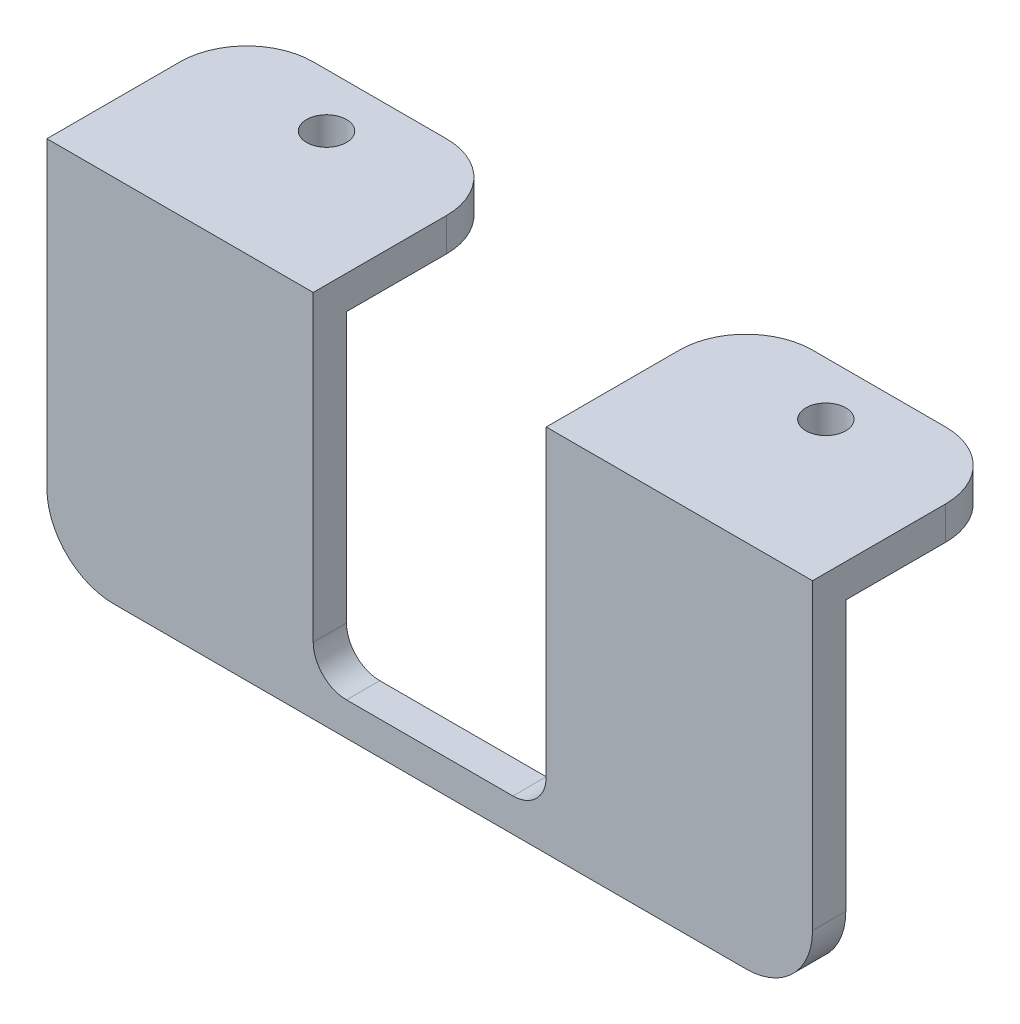
ISO-10303-21;
HEADER;
FILE_DESCRIPTION(('STEP AP214'),'2;1');
FILE_NAME('part.step','',(''),(''),'','','');
FILE_SCHEMA(('AUTOMOTIVE_DESIGN { 1 0 10303 214 1 1 1 1 }'));
ENDSEC;
DATA;
#1=APPLICATION_CONTEXT('core data for automotive mechanical design processes');
#2=APPLICATION_PROTOCOL_DEFINITION('international standard','automotive_design',2000,#1);
#3=PRODUCT_CONTEXT('',#1,'mechanical');
#4=PRODUCT('Part','Part','',(#3));
#5=PRODUCT_RELATED_PRODUCT_CATEGORY('part','',(#4));
#6=PRODUCT_DEFINITION_FORMATION('','',#4);
#7=PRODUCT_DEFINITION_CONTEXT('part definition',#1,'design');
#8=PRODUCT_DEFINITION('design','',#6,#7);
#9=PRODUCT_DEFINITION_SHAPE('','',#8);
#10=(LENGTH_UNIT() NAMED_UNIT(*) SI_UNIT(.MILLI.,.METRE.));
#11=(NAMED_UNIT(*) PLANE_ANGLE_UNIT() SI_UNIT($,.RADIAN.));
#12=(NAMED_UNIT(*) SI_UNIT($,.STERADIAN.) SOLID_ANGLE_UNIT());
#13=UNCERTAINTY_MEASURE_WITH_UNIT(LENGTH_MEASURE(1.E-05),#10,'distance_accuracy_value','');
#14=(GEOMETRIC_REPRESENTATION_CONTEXT(3) GLOBAL_UNCERTAINTY_ASSIGNED_CONTEXT((#13)) GLOBAL_UNIT_ASSIGNED_CONTEXT((#10,
#11,#12)) REPRESENTATION_CONTEXT('',''));
#15=CARTESIAN_POINT('',(0.,0.,0.));
#16=DIRECTION('',(0.,0.,1.));
#17=DIRECTION('',(1.,0.,0.));
#18=AXIS2_PLACEMENT_3D('',#15,#16,#17);
#19=CARTESIAN_POINT('',(0.,0.,0.));
#20=DIRECTION('',(0.,1.,0.));
#21=DIRECTION('',(0.,0.,1.));
#22=AXIS2_PLACEMENT_3D('',#19,#20,#21);
#23=PLANE('',#22);
#24=CARTESIAN_POINT('',(37.5,0.,-22.));
#25=DIRECTION('',(0.,1.,0.));
#26=DIRECTION('',(0.,0.,1.));
#27=AXIS2_PLACEMENT_3D('',#24,#25,#26);
#28=CIRCLE('',#27,3.);
#29=CARTESIAN_POINT('',(37.5,0.,-19.));
#30=VERTEX_POINT('',#29);
#31=EDGE_CURVE('E313',#30,#30,#28,.T.);
#32=ORIENTED_EDGE('',*,*,#31,.T.);
#33=EDGE_LOOP('',(#32));
#34=FACE_BOUND('',#33,.T.);
#35=DIRECTION('',(-1.,0.,0.));
#36=VECTOR('',#35,1.);
#37=CARTESIAN_POINT('',(17.5,0.,-30.));
#38=LINE('',#37,#36);
#39=CARTESIAN_POINT('',(47.5,0.,-30.));
#40=VERTEX_POINT('',#39);
#41=CARTESIAN_POINT('',(27.5,0.,-30.));
#42=VERTEX_POINT('',#41);
#43=EDGE_CURVE('E347',#40,#42,#38,.T.);
#44=ORIENTED_EDGE('',*,*,#43,.F.);
#45=CARTESIAN_POINT('',(47.5,0.,-20.));
#46=DIRECTION('',(0.,1.,0.));
#47=DIRECTION('',(0.,0.,1.));
#48=AXIS2_PLACEMENT_3D('',#45,#46,#47);
#49=CIRCLE('',#48,10.);
#50=CARTESIAN_POINT('',(57.5,0.,-20.));
#51=VERTEX_POINT('',#50);
#52=EDGE_CURVE('E408',#40,#51,#49,.F.);
#53=ORIENTED_EDGE('',*,*,#52,.T.);
#54=DIRECTION('',(0.,0.,-1.));
#55=VECTOR('',#54,1.);
#56=CARTESIAN_POINT('',(57.5,0.,-30.));
#57=LINE('',#56,#55);
#58=CARTESIAN_POINT('',(57.5,0.,-5.));
#59=VERTEX_POINT('',#58);
#60=EDGE_CURVE('E359',#59,#51,#57,.T.);
#61=ORIENTED_EDGE('',*,*,#60,.F.);
#62=DIRECTION('',(1.,0.,0.));
#63=VECTOR('',#62,1.);
#64=CARTESIAN_POINT('',(17.5,0.,-5.));
#65=LINE('',#64,#63);
#66=CARTESIAN_POINT('',(17.5,0.,-5.));
#67=VERTEX_POINT('',#66);
#68=EDGE_CURVE('E326',#67,#59,#65,.T.);
#69=ORIENTED_EDGE('',*,*,#68,.F.);
#70=DIRECTION('',(0.,0.,1.));
#71=VECTOR('',#70,1.);
#72=CARTESIAN_POINT('',(17.5,0.,-30.));
#73=LINE('',#72,#71);
#74=CARTESIAN_POINT('',(17.5,0.,-20.));
#75=VERTEX_POINT('',#74);
#76=EDGE_CURVE('E342',#75,#67,#73,.T.);
#77=ORIENTED_EDGE('',*,*,#76,.F.);
#78=CARTESIAN_POINT('',(27.5,0.,-20.));
#79=DIRECTION('',(0.,1.,0.));
#80=DIRECTION('',(0.,0.,1.));
#81=AXIS2_PLACEMENT_3D('',#78,#79,#80);
#82=CIRCLE('',#81,10.);
#83=EDGE_CURVE('E405',#75,#42,#82,.F.);
#84=ORIENTED_EDGE('',*,*,#83,.T.);
#85=EDGE_LOOP('',(#44,#53,#61,#69,#77,#84));
#86=FACE_BOUND('',#85,.T.);
#87=ADVANCED_FACE('F45',(#34,#86),#23,.F.);
#88=CARTESIAN_POINT('',(17.5,5.,-30.));
#89=DIRECTION('',(1.,0.,0.));
#90=DIRECTION('',(0.,0.,-1.));
#91=AXIS2_PLACEMENT_3D('',#88,#89,#90);
#92=PLANE('',#91);
#93=DIRECTION('',(0.,0.,1.));
#94=VECTOR('',#93,1.);
#95=CARTESIAN_POINT('',(17.5,5.,-30.));
#96=LINE('',#95,#94);
#97=CARTESIAN_POINT('',(17.5,5.,-20.));
#98=VERTEX_POINT('',#97);
#99=CARTESIAN_POINT('',(17.5,5.,0.));
#100=VERTEX_POINT('',#99);
#101=EDGE_CURVE('E343',#98,#100,#96,.T.);
#102=ORIENTED_EDGE('',*,*,#101,.F.);
#103=DIRECTION('',(0.,-1.,0.));
#104=VECTOR('',#103,1.);
#105=CARTESIAN_POINT('',(17.5,5.,-20.));
#106=LINE('',#105,#104);
#107=EDGE_CURVE('E11',#98,#75,#106,.T.);
#108=ORIENTED_EDGE('',*,*,#107,.T.);
#109=ORIENTED_EDGE('',*,*,#76,.T.);
#110=DIRECTION('',(0.,1.,0.));
#111=VECTOR('',#110,1.);
#112=CARTESIAN_POINT('',(17.5,-45.5,-5.));
#113=LINE('',#112,#111);
#114=CARTESIAN_POINT('',(17.5,-40.5,-5.));
#115=VERTEX_POINT('',#114);
#116=EDGE_CURVE('E338',#115,#67,#113,.T.);
#117=ORIENTED_EDGE('',*,*,#116,.F.);
#118=DIRECTION('',(0.,0.,-1.));
#119=VECTOR('',#118,1.);
#120=CARTESIAN_POINT('',(17.5,-40.5,0.));
#121=LINE('',#120,#119);
#122=CARTESIAN_POINT('',(17.5,-40.5,0.));
#123=VERTEX_POINT('',#122);
#124=EDGE_CURVE('E389',#115,#123,#121,.F.);
#125=ORIENTED_EDGE('',*,*,#124,.T.);
#126=DIRECTION('',(0.,-1.,0.));
#127=VECTOR('',#126,1.);
#128=CARTESIAN_POINT('',(17.5,5.,0.));
#129=LINE('',#128,#127);
#130=EDGE_CURVE('E368',#100,#123,#129,.T.);
#131=ORIENTED_EDGE('',*,*,#130,.F.);
#132=EDGE_LOOP('',(#102,#108,#109,#117,#125,#131));
#133=FACE_BOUND('',#132,.T.);
#134=ADVANCED_FACE('F476',(#133),#92,.F.);
#135=CARTESIAN_POINT('',(17.5,5.,0.));
#136=DIRECTION('',(0.,0.,-1.));
#137=DIRECTION('',(-1.,0.,0.));
#138=AXIS2_PLACEMENT_3D('',#135,#136,#137);
#139=PLANE('',#138);
#140=DIRECTION('',(-1.,0.,0.));
#141=VECTOR('',#140,1.);
#142=CARTESIAN_POINT('',(57.5,-50.5,0.));
#143=LINE('',#142,#141);
#144=CARTESIAN_POINT('',(47.5,-50.5,0.));
#145=VERTEX_POINT('',#144);
#146=CARTESIAN_POINT('',(-47.5,-50.5,0.));
#147=VERTEX_POINT('',#146);
#148=EDGE_CURVE('E318',#145,#147,#143,.T.);
#149=ORIENTED_EDGE('',*,*,#148,.F.);
#150=CARTESIAN_POINT('',(47.5,-40.5,0.));
#151=DIRECTION('',(0.,0.,-1.));
#152=DIRECTION('',(-1.,0.,0.));
#153=AXIS2_PLACEMENT_3D('',#150,#151,#152);
#154=CIRCLE('',#153,10.);
#155=CARTESIAN_POINT('',(57.5,-40.5,0.));
#156=VERTEX_POINT('',#155);
#157=EDGE_CURVE('E376',#145,#156,#154,.F.);
#158=ORIENTED_EDGE('',*,*,#157,.T.);
#159=DIRECTION('',(0.,-1.,0.));
#160=VECTOR('',#159,1.);
#161=CARTESIAN_POINT('',(57.5,5.,0.));
#162=LINE('',#161,#160);
#163=CARTESIAN_POINT('',(57.5,5.,0.));
#164=VERTEX_POINT('',#163);
#165=EDGE_CURVE('E356',#164,#156,#162,.T.);
#166=ORIENTED_EDGE('',*,*,#165,.F.);
#167=DIRECTION('',(1.,0.,0.));
#168=VECTOR('',#167,1.);
#169=CARTESIAN_POINT('',(17.5,5.,0.));
#170=LINE('',#169,#168);
#171=EDGE_CURVE('E346',#100,#164,#170,.T.);
#172=ORIENTED_EDGE('',*,*,#171,.F.);
#173=ORIENTED_EDGE('',*,*,#130,.T.);
#174=CARTESIAN_POINT('',(12.5,-40.5,0.));
#175=DIRECTION('',(0.,0.,-1.));
#176=DIRECTION('',(-1.,0.,0.));
#177=AXIS2_PLACEMENT_3D('',#174,#175,#176);
#178=CIRCLE('',#177,5.);
#179=CARTESIAN_POINT('',(12.5,-45.5,0.));
#180=VERTEX_POINT('',#179);
#181=EDGE_CURVE('E395',#123,#180,#178,.T.);
#182=ORIENTED_EDGE('',*,*,#181,.T.);
#183=DIRECTION('',(-1.,0.,0.));
#184=VECTOR('',#183,1.);
#185=CARTESIAN_POINT('',(57.5,-45.5,0.));
#186=LINE('',#185,#184);
#187=CARTESIAN_POINT('',(-12.5,-45.5,0.));
#188=VERTEX_POINT('',#187);
#189=EDGE_CURVE('E317',#180,#188,#186,.T.);
#190=ORIENTED_EDGE('',*,*,#189,.T.);
#191=CARTESIAN_POINT('',(-12.5,-40.5,0.));
#192=DIRECTION('',(0.,0.,1.));
#193=DIRECTION('',(1.,0.,0.));
#194=AXIS2_PLACEMENT_3D('',#191,#192,#193);
#195=CIRCLE('',#194,5.);
#196=CARTESIAN_POINT('',(-17.5,-40.5,0.));
#197=VERTEX_POINT('',#196);
#198=EDGE_CURVE('E280',#197,#188,#195,.T.);
#199=ORIENTED_EDGE('',*,*,#198,.F.);
#200=DIRECTION('',(0.,-1.,0.));
#201=VECTOR('',#200,1.);
#202=CARTESIAN_POINT('',(-17.5,5.,0.));
#203=LINE('',#202,#201);
#204=CARTESIAN_POINT('',(-17.5,5.,0.));
#205=VERTEX_POINT('',#204);
#206=EDGE_CURVE('E252',#205,#197,#203,.T.);
#207=ORIENTED_EDGE('',*,*,#206,.F.);
#208=DIRECTION('',(-1.,0.,0.));
#209=VECTOR('',#208,1.);
#210=CARTESIAN_POINT('',(-17.5,5.,0.));
#211=LINE('',#210,#209);
#212=CARTESIAN_POINT('',(-57.5,5.,0.));
#213=VERTEX_POINT('',#212);
#214=EDGE_CURVE('E233',#205,#213,#211,.T.);
#215=ORIENTED_EDGE('',*,*,#214,.T.);
#216=DIRECTION('',(0.,-1.,0.));
#217=VECTOR('',#216,1.);
#218=CARTESIAN_POINT('',(-57.5,5.,0.));
#219=LINE('',#218,#217);
#220=CARTESIAN_POINT('',(-57.5,-40.5,0.));
#221=VERTEX_POINT('',#220);
#222=EDGE_CURVE('E244',#213,#221,#219,.T.);
#223=ORIENTED_EDGE('',*,*,#222,.T.);
#224=CARTESIAN_POINT('',(-47.5,-40.5,0.));
#225=DIRECTION('',(0.,0.,1.));
#226=DIRECTION('',(1.,0.,0.));
#227=AXIS2_PLACEMENT_3D('',#224,#225,#226);
#228=CIRCLE('',#227,10.);
#229=EDGE_CURVE('E260',#147,#221,#228,.F.);
#230=ORIENTED_EDGE('',*,*,#229,.F.);
#231=EDGE_LOOP('',(#149,#158,#166,#172,#173,#182,#190,#199,#207,#215,#223,#230));
#232=FACE_BOUND('',#231,.T.);
#233=ADVANCED_FACE('F440',(#232),#139,.F.);
#234=CARTESIAN_POINT('',(57.5,5.,-30.));
#235=DIRECTION('',(-1.,0.,0.));
#236=DIRECTION('',(0.,0.,1.));
#237=AXIS2_PLACEMENT_3D('',#234,#235,#236);
#238=PLANE('',#237);
#239=ORIENTED_EDGE('',*,*,#60,.T.);
#240=DIRECTION('',(0.,-1.,0.));
#241=VECTOR('',#240,1.);
#242=CARTESIAN_POINT('',(57.5,5.,-20.));
#243=LINE('',#242,#241);
#244=CARTESIAN_POINT('',(57.5,5.,-20.));
#245=VERTEX_POINT('',#244);
#246=EDGE_CURVE('E69',#51,#245,#243,.F.);
#247=ORIENTED_EDGE('',*,*,#246,.T.);
#248=DIRECTION('',(0.,0.,-1.));
#249=VECTOR('',#248,1.);
#250=CARTESIAN_POINT('',(57.5,5.,-30.));
#251=LINE('',#250,#249);
#252=EDGE_CURVE('E350',#164,#245,#251,.T.);
#253=ORIENTED_EDGE('',*,*,#252,.F.);
#254=ORIENTED_EDGE('',*,*,#165,.T.);
#255=DIRECTION('',(0.,0.,1.));
#256=VECTOR('',#255,1.);
#257=CARTESIAN_POINT('',(57.5,-40.5,-5.));
#258=LINE('',#257,#256);
#259=CARTESIAN_POINT('',(57.5,-40.5,-5.));
#260=VERTEX_POINT('',#259);
#261=EDGE_CURVE('E379',#156,#260,#258,.F.);
#262=ORIENTED_EDGE('',*,*,#261,.T.);
#263=DIRECTION('',(0.,1.,0.));
#264=VECTOR('',#263,1.);
#265=CARTESIAN_POINT('',(57.5,-45.5,-5.));
#266=LINE('',#265,#264);
#267=EDGE_CURVE('E335',#260,#59,#266,.T.);
#268=ORIENTED_EDGE('',*,*,#267,.T.);
#269=EDGE_LOOP('',(#239,#247,#253,#254,#262,#268));
#270=FACE_BOUND('',#269,.T.);
#271=ADVANCED_FACE('F428',(#270),#238,.F.);
#272=CARTESIAN_POINT('',(17.5,5.,-30.));
#273=DIRECTION('',(0.,0.,1.));
#274=DIRECTION('',(1.,0.,0.));
#275=AXIS2_PLACEMENT_3D('',#272,#273,#274);
#276=PLANE('',#275);
#277=DIRECTION('',(-1.,0.,0.));
#278=VECTOR('',#277,1.);
#279=CARTESIAN_POINT('',(17.5,5.,-30.));
#280=LINE('',#279,#278);
#281=CARTESIAN_POINT('',(47.5,5.,-30.));
#282=VERTEX_POINT('',#281);
#283=CARTESIAN_POINT('',(27.5,5.,-30.));
#284=VERTEX_POINT('',#283);
#285=EDGE_CURVE('E353',#282,#284,#280,.T.);
#286=ORIENTED_EDGE('',*,*,#285,.F.);
#287=DIRECTION('',(0.,-1.,0.));
#288=VECTOR('',#287,1.);
#289=CARTESIAN_POINT('',(47.5,5.,-30.));
#290=LINE('',#289,#288);
#291=EDGE_CURVE('E401',#282,#40,#290,.T.);
#292=ORIENTED_EDGE('',*,*,#291,.T.);
#293=ORIENTED_EDGE('',*,*,#43,.T.);
#294=DIRECTION('',(0.,-1.,0.));
#295=VECTOR('',#294,1.);
#296=CARTESIAN_POINT('',(27.5,5.,-30.));
#297=LINE('',#296,#295);
#298=EDGE_CURVE('E398',#42,#284,#297,.F.);
#299=ORIENTED_EDGE('',*,*,#298,.T.);
#300=EDGE_LOOP('',(#286,#292,#293,#299));
#301=FACE_BOUND('',#300,.T.);
#302=ADVANCED_FACE('F421',(#301),#276,.F.);
#303=CARTESIAN_POINT('',(0.,5.,0.));
#304=DIRECTION('',(0.,1.,0.));
#305=DIRECTION('',(0.,0.,1.));
#306=AXIS2_PLACEMENT_3D('',#303,#304,#305);
#307=PLANE('',#306);
#308=CARTESIAN_POINT('',(37.5,5.,-22.));
#309=DIRECTION('',(0.,1.,0.));
#310=DIRECTION('',(0.,0.,1.));
#311=AXIS2_PLACEMENT_3D('',#308,#309,#310);
#312=CIRCLE('',#311,3.);
#313=CARTESIAN_POINT('',(37.5,5.,-19.));
#314=VERTEX_POINT('',#313);
#315=EDGE_CURVE('E309',#314,#314,#312,.T.);
#316=ORIENTED_EDGE('',*,*,#315,.F.);
#317=EDGE_LOOP('',(#316));
#318=FACE_BOUND('',#317,.T.);
#319=ORIENTED_EDGE('',*,*,#252,.T.);
#320=CARTESIAN_POINT('',(47.5,5.,-20.));
#321=DIRECTION('',(0.,1.,0.));
#322=DIRECTION('',(0.,0.,1.));
#323=AXIS2_PLACEMENT_3D('',#320,#321,#322);
#324=CIRCLE('',#323,10.);
#325=EDGE_CURVE('E54',#245,#282,#324,.T.);
#326=ORIENTED_EDGE('',*,*,#325,.T.);
#327=ORIENTED_EDGE('',*,*,#285,.T.);
#328=CARTESIAN_POINT('',(27.5,5.,-20.));
#329=DIRECTION('',(0.,1.,0.));
#330=DIRECTION('',(0.,0.,1.));
#331=AXIS2_PLACEMENT_3D('',#328,#329,#330);
#332=CIRCLE('',#331,10.);
#333=EDGE_CURVE('E61',#284,#98,#332,.T.);
#334=ORIENTED_EDGE('',*,*,#333,.T.);
#335=ORIENTED_EDGE('',*,*,#101,.T.);
#336=ORIENTED_EDGE('',*,*,#171,.T.);
#337=EDGE_LOOP('',(#319,#326,#327,#334,#335,#336));
#338=FACE_BOUND('',#337,.T.);
#339=ADVANCED_FACE('F417',(#318,#338),#307,.T.);
#340=CARTESIAN_POINT('',(17.5,-45.5,-5.));
#341=DIRECTION('',(0.,0.,1.));
#342=DIRECTION('',(1.,0.,0.));
#343=AXIS2_PLACEMENT_3D('',#340,#341,#342);
#344=PLANE('',#343);
#345=ORIENTED_EDGE('',*,*,#267,.F.);
#346=CARTESIAN_POINT('',(47.5,-40.5,-5.));
#347=DIRECTION('',(0.,0.,1.));
#348=DIRECTION('',(1.,0.,0.));
#349=AXIS2_PLACEMENT_3D('',#346,#347,#348);
#350=CIRCLE('',#349,10.);
#351=CARTESIAN_POINT('',(47.5,-50.5,-5.));
#352=VERTEX_POINT('',#351);
#353=EDGE_CURVE('E382',#260,#352,#350,.F.);
#354=ORIENTED_EDGE('',*,*,#353,.T.);
#355=DIRECTION('',(1.,0.,0.));
#356=VECTOR('',#355,1.);
#357=CARTESIAN_POINT('',(57.5,-50.5,-5.));
#358=LINE('',#357,#356);
#359=CARTESIAN_POINT('',(-47.5,-50.5,-5.));
#360=VERTEX_POINT('',#359);
#361=EDGE_CURVE('E321',#360,#352,#358,.T.);
#362=ORIENTED_EDGE('',*,*,#361,.F.);
#363=CARTESIAN_POINT('',(-47.5,-40.5,-5.));
#364=DIRECTION('',(0.,0.,-1.));
#365=DIRECTION('',(-1.,0.,0.));
#366=AXIS2_PLACEMENT_3D('',#363,#364,#365);
#367=CIRCLE('',#366,10.);
#368=CARTESIAN_POINT('',(-57.5,-40.5,-5.));
#369=VERTEX_POINT('',#368);
#370=EDGE_CURVE('E195',#369,#360,#367,.F.);
#371=ORIENTED_EDGE('',*,*,#370,.F.);
#372=DIRECTION('',(0.,1.,0.));
#373=VECTOR('',#372,1.);
#374=CARTESIAN_POINT('',(-57.5,-45.5,-5.));
#375=LINE('',#374,#373);
#376=CARTESIAN_POINT('',(-57.5,0.,-5.));
#377=VERTEX_POINT('',#376);
#378=EDGE_CURVE('E186',#369,#377,#375,.T.);
#379=ORIENTED_EDGE('',*,*,#378,.T.);
#380=DIRECTION('',(-1.,0.,0.));
#381=VECTOR('',#380,1.);
#382=CARTESIAN_POINT('',(-17.5,0.,-5.));
#383=LINE('',#382,#381);
#384=CARTESIAN_POINT('',(-17.5,0.,-5.));
#385=VERTEX_POINT('',#384);
#386=EDGE_CURVE('E192',#385,#377,#383,.T.);
#387=ORIENTED_EDGE('',*,*,#386,.F.);
#388=DIRECTION('',(0.,1.,0.));
#389=VECTOR('',#388,1.);
#390=CARTESIAN_POINT('',(-17.5,-45.5,-5.));
#391=LINE('',#390,#389);
#392=CARTESIAN_POINT('',(-17.5,-40.5,-5.));
#393=VERTEX_POINT('',#392);
#394=EDGE_CURVE('E199',#393,#385,#391,.T.);
#395=ORIENTED_EDGE('',*,*,#394,.F.);
#396=CARTESIAN_POINT('',(-12.5,-40.5,-5.));
#397=DIRECTION('',(0.,0.,-1.));
#398=DIRECTION('',(-1.,0.,0.));
#399=AXIS2_PLACEMENT_3D('',#396,#397,#398);
#400=CIRCLE('',#399,5.);
#401=CARTESIAN_POINT('',(-12.5,-45.5,-5.));
#402=VERTEX_POINT('',#401);
#403=EDGE_CURVE('E277',#402,#393,#400,.T.);
#404=ORIENTED_EDGE('',*,*,#403,.F.);
#405=DIRECTION('',(1.,0.,0.));
#406=VECTOR('',#405,1.);
#407=CARTESIAN_POINT('',(57.5,-45.5,-5.));
#408=LINE('',#407,#406);
#409=CARTESIAN_POINT('',(12.5,-45.5,-5.));
#410=VERTEX_POINT('',#409);
#411=EDGE_CURVE('E322',#402,#410,#408,.T.);
#412=ORIENTED_EDGE('',*,*,#411,.T.);
#413=CARTESIAN_POINT('',(12.5,-40.5,-5.));
#414=DIRECTION('',(0.,0.,1.));
#415=DIRECTION('',(1.,0.,0.));
#416=AXIS2_PLACEMENT_3D('',#413,#414,#415);
#417=CIRCLE('',#416,5.);
#418=EDGE_CURVE('E392',#410,#115,#417,.T.);
#419=ORIENTED_EDGE('',*,*,#418,.T.);
#420=ORIENTED_EDGE('',*,*,#116,.T.);
#421=ORIENTED_EDGE('',*,*,#68,.T.);
#422=EDGE_LOOP('',(#345,#354,#362,#371,#379,#387,#395,#404,#412,#419,#420,#421));
#423=FACE_BOUND('',#422,.T.);
#424=ADVANCED_FACE('F189',(#423),#344,.F.);
#425=CARTESIAN_POINT('',(0.,-45.5,0.));
#426=DIRECTION('',(0.,-1.,0.));
#427=DIRECTION('',(0.,0.,-1.));
#428=AXIS2_PLACEMENT_3D('',#425,#426,#427);
#429=PLANE('',#428);
#430=ORIENTED_EDGE('',*,*,#189,.F.);
#431=DIRECTION('',(0.,0.,-1.));
#432=VECTOR('',#431,1.);
#433=CARTESIAN_POINT('',(12.5,-45.5,-5.));
#434=LINE('',#433,#432);
#435=EDGE_CURVE('E385',#180,#410,#434,.T.);
#436=ORIENTED_EDGE('',*,*,#435,.T.);
#437=ORIENTED_EDGE('',*,*,#411,.F.);
#438=DIRECTION('',(0.,0.,-1.));
#439=VECTOR('',#438,1.);
#440=CARTESIAN_POINT('',(-12.5,-45.5,-5.));
#441=LINE('',#440,#439);
#442=EDGE_CURVE('E269',#188,#402,#441,.T.);
#443=ORIENTED_EDGE('',*,*,#442,.F.);
#444=EDGE_LOOP('',(#430,#436,#437,#443));
#445=FACE_BOUND('',#444,.T.);
#446=ADVANCED_FACE('F468',(#445),#429,.F.);
#447=CARTESIAN_POINT('',(0.,-50.5,0.));
#448=DIRECTION('',(0.,-1.,0.));
#449=DIRECTION('',(0.,0.,-1.));
#450=AXIS2_PLACEMENT_3D('',#447,#448,#449);
#451=PLANE('',#450);
#452=ORIENTED_EDGE('',*,*,#361,.T.);
#453=DIRECTION('',(0.,0.,1.));
#454=VECTOR('',#453,1.);
#455=CARTESIAN_POINT('',(47.5,-50.5,0.));
#456=LINE('',#455,#454);
#457=EDGE_CURVE('E372',#352,#145,#456,.T.);
#458=ORIENTED_EDGE('',*,*,#457,.T.);
#459=ORIENTED_EDGE('',*,*,#148,.T.);
#460=DIRECTION('',(0.,0.,1.));
#461=VECTOR('',#460,1.);
#462=CARTESIAN_POINT('',(-47.5,-50.5,0.));
#463=LINE('',#462,#461);
#464=EDGE_CURVE('E256',#360,#147,#463,.T.);
#465=ORIENTED_EDGE('',*,*,#464,.F.);
#466=EDGE_LOOP('',(#452,#458,#459,#465));
#467=FACE_BOUND('',#466,.T.);
#468=ADVANCED_FACE('F436',(#467),#451,.T.);
#469=CARTESIAN_POINT('',(47.5,-40.5,0.));
#470=DIRECTION('',(0.,0.,-1.));
#471=DIRECTION('',(-1.,0.,0.));
#472=AXIS2_PLACEMENT_3D('',#469,#470,#471);
#473=CYLINDRICAL_SURFACE('',#472,10.);
#474=ORIENTED_EDGE('',*,*,#353,.F.);
#475=ORIENTED_EDGE('',*,*,#261,.F.);
#476=ORIENTED_EDGE('',*,*,#157,.F.);
#477=ORIENTED_EDGE('',*,*,#457,.F.);
#478=EDGE_LOOP('',(#474,#475,#476,#477));
#479=FACE_BOUND('',#478,.T.);
#480=ADVANCED_FACE('F433',(#479),#473,.T.);
#481=CARTESIAN_POINT('',(12.5,-40.5,0.));
#482=DIRECTION('',(0.,0.,1.));
#483=DIRECTION('',(1.,0.,0.));
#484=AXIS2_PLACEMENT_3D('',#481,#482,#483);
#485=CYLINDRICAL_SURFACE('',#484,5.);
#486=ORIENTED_EDGE('',*,*,#181,.F.);
#487=ORIENTED_EDGE('',*,*,#124,.F.);
#488=ORIENTED_EDGE('',*,*,#418,.F.);
#489=ORIENTED_EDGE('',*,*,#435,.F.);
#490=EDGE_LOOP('',(#486,#487,#488,#489));
#491=FACE_BOUND('',#490,.T.);
#492=ADVANCED_FACE('F472',(#491),#485,.F.);
#493=CARTESIAN_POINT('',(47.5,5.,-20.));
#494=DIRECTION('',(0.,-1.,0.));
#495=DIRECTION('',(0.,0.,-1.));
#496=AXIS2_PLACEMENT_3D('',#493,#494,#495);
#497=CYLINDRICAL_SURFACE('',#496,10.);
#498=ORIENTED_EDGE('',*,*,#325,.F.);
#499=ORIENTED_EDGE('',*,*,#246,.F.);
#500=ORIENTED_EDGE('',*,*,#52,.F.);
#501=ORIENTED_EDGE('',*,*,#291,.F.);
#502=EDGE_LOOP('',(#498,#499,#500,#501));
#503=FACE_BOUND('',#502,.T.);
#504=ADVANCED_FACE('F424',(#503),#497,.T.);
#505=CARTESIAN_POINT('',(27.5,5.,-20.));
#506=DIRECTION('',(0.,-1.,0.));
#507=DIRECTION('',(0.,0.,-1.));
#508=AXIS2_PLACEMENT_3D('',#505,#506,#507);
#509=CYLINDRICAL_SURFACE('',#508,10.);
#510=ORIENTED_EDGE('',*,*,#333,.F.);
#511=ORIENTED_EDGE('',*,*,#298,.F.);
#512=ORIENTED_EDGE('',*,*,#83,.F.);
#513=ORIENTED_EDGE('',*,*,#107,.F.);
#514=EDGE_LOOP('',(#510,#511,#512,#513));
#515=FACE_BOUND('',#514,.T.);
#516=ADVANCED_FACE('F47',(#515),#509,.T.);
#517=CARTESIAN_POINT('',(37.5,-50.5,-22.));
#518=DIRECTION('',(0.,1.,0.));
#519=DIRECTION('',(0.,0.,1.));
#520=AXIS2_PLACEMENT_3D('',#517,#518,#519);
#521=CYLINDRICAL_SURFACE('',#520,3.);
#522=CARTESIAN_POINT('',(37.5,5.,-19.));
#523=CARTESIAN_POINT('',(37.5,4.94791666666667,-19.));
#524=CARTESIAN_POINT('',(37.5,4.89583333333334,-19.));
#525=CARTESIAN_POINT('',(37.5,4.79166666666667,-19.));
#526=CARTESIAN_POINT('',(37.5,4.73958333333334,-19.));
#527=CARTESIAN_POINT('',(37.5,4.63541666666667,-19.));
#528=CARTESIAN_POINT('',(37.5,4.58333333333333,-19.));
#529=CARTESIAN_POINT('',(37.5,4.47916666666667,-19.));
#530=CARTESIAN_POINT('',(37.5,4.42708333333334,-19.));
#531=CARTESIAN_POINT('',(37.5,4.32291666666667,-19.));
#532=CARTESIAN_POINT('',(37.5,4.27083333333334,-19.));
#533=CARTESIAN_POINT('',(37.5,4.16666666666667,-19.));
#534=CARTESIAN_POINT('',(37.5,4.11458333333334,-19.));
#535=CARTESIAN_POINT('',(37.5,4.01041666666667,-19.));
#536=CARTESIAN_POINT('',(37.5,3.95833333333333,-19.));
#537=CARTESIAN_POINT('',(37.5,3.85416666666667,-19.));
#538=CARTESIAN_POINT('',(37.5,3.80208333333334,-19.));
#539=CARTESIAN_POINT('',(37.5,3.69791666666667,-19.));
#540=CARTESIAN_POINT('',(37.5,3.64583333333334,-19.));
#541=CARTESIAN_POINT('',(37.5,3.54166666666667,-19.));
#542=CARTESIAN_POINT('',(37.5,3.48958333333334,-19.));
#543=CARTESIAN_POINT('',(37.5,3.38541666666667,-19.));
#544=CARTESIAN_POINT('',(37.5,3.33333333333333,-19.));
#545=CARTESIAN_POINT('',(37.5,3.22916666666667,-19.));
#546=CARTESIAN_POINT('',(37.5,3.17708333333334,-19.));
#547=CARTESIAN_POINT('',(37.5,3.07291666666667,-19.));
#548=CARTESIAN_POINT('',(37.5,3.02083333333334,-19.));
#549=CARTESIAN_POINT('',(37.5,2.91666666666667,-19.));
#550=CARTESIAN_POINT('',(37.5,2.86458333333334,-19.));
#551=CARTESIAN_POINT('',(37.5,2.76041666666667,-19.));
#552=CARTESIAN_POINT('',(37.5,2.70833333333333,-19.));
#553=CARTESIAN_POINT('',(37.5,2.60416666666667,-19.));
#554=CARTESIAN_POINT('',(37.5,2.55208333333333,-19.));
#555=CARTESIAN_POINT('',(37.5,2.44791666666667,-19.));
#556=CARTESIAN_POINT('',(37.5,2.39583333333334,-19.));
#557=CARTESIAN_POINT('',(37.5,2.29166666666667,-19.));
#558=CARTESIAN_POINT('',(37.5,2.23958333333334,-19.));
#559=CARTESIAN_POINT('',(37.5,2.13541666666667,-19.));
#560=CARTESIAN_POINT('',(37.5,2.08333333333333,-19.));
#561=CARTESIAN_POINT('',(37.5,1.97916666666667,-19.));
#562=CARTESIAN_POINT('',(37.5,1.92708333333333,-19.));
#563=CARTESIAN_POINT('',(37.5,1.82291666666667,-19.));
#564=CARTESIAN_POINT('',(37.5,1.77083333333334,-19.));
#565=CARTESIAN_POINT('',(37.5,1.66666666666667,-19.));
#566=CARTESIAN_POINT('',(37.5,1.61458333333334,-19.));
#567=CARTESIAN_POINT('',(37.5,1.51041666666667,-19.));
#568=CARTESIAN_POINT('',(37.5,1.45833333333333,-19.));
#569=CARTESIAN_POINT('',(37.5,1.35416666666667,-19.));
#570=CARTESIAN_POINT('',(37.5,1.30208333333333,-19.));
#571=CARTESIAN_POINT('',(37.5,1.19791666666667,-19.));
#572=CARTESIAN_POINT('',(37.5,1.14583333333334,-19.));
#573=CARTESIAN_POINT('',(37.5,1.04166666666667,-19.));
#574=CARTESIAN_POINT('',(37.5,0.989583333333335,-19.));
#575=CARTESIAN_POINT('',(37.5,0.885416666666666,-19.));
#576=CARTESIAN_POINT('',(37.5,0.833333333333332,-19.));
#577=CARTESIAN_POINT('',(37.5,0.729166666666665,-19.));
#578=CARTESIAN_POINT('',(37.5,0.677083333333333,-19.));
#579=CARTESIAN_POINT('',(37.5,0.572916666666668,-19.));
#580=CARTESIAN_POINT('',(37.5,0.520833333333336,-19.));
#581=CARTESIAN_POINT('',(37.5,0.416666666666669,-19.));
#582=CARTESIAN_POINT('',(37.5,0.364583333333335,-19.));
#583=CARTESIAN_POINT('',(37.5,0.260416666666666,-19.));
#584=CARTESIAN_POINT('',(37.5,0.208333333333331,-19.));
#585=CARTESIAN_POINT('',(37.5,0.104166666666664,-19.));
#586=CARTESIAN_POINT('',(37.5,0.0520833333333322,-19.));
#587=CARTESIAN_POINT('',(37.5,0.,-19.));
#588=B_SPLINE_CURVE_WITH_KNOTS('',3,(#522,#523,#524,#525,#526,#527,#528,#529,#530,#531,#532,
#533,#534,#535,#536,#537,#538,#539,#540,#541,#542,#543,#544,#545,#546,#547,#548,#549,#550,#551,
#552,#553,#554,#555,#556,#557,#558,#559,#560,#561,#562,#563,#564,#565,#566,#567,#568,#569,#570,
#571,#572,#573,#574,#575,#576,#577,#578,#579,#580,#581,#582,#583,#584,#585,#586,#587),
.UNSPECIFIED.,.F.,.F.,(4,2,2,2,2,2,2,2,2,2,2,2,2,2,2,2,2,2,2,2,2,2,2,2,2,2,2,2,2,2,2,2,4),(0.,
0.156249999999997,0.3125,0.468750000000004,0.625000000000001,0.781249999999997,
0.937500000000001,1.09375,1.25,1.40625,1.5625,1.71875,1.875,2.03125,2.1875,2.34375000000001,2.5,
2.65625,2.8125,2.96875000000001,3.125,3.28125,3.4375,3.59375000000001,3.75,3.90625,4.0625,
4.21875000000001,4.375,4.53125,4.6875,4.84375000000001,5.),.UNSPECIFIED.);
#589=EDGE_CURVE('BSEAM482',#314,#30,#588,.T.);
#590=ORIENTED_EDGE('',*,*,#315,.T.);
#591=ORIENTED_EDGE('',*,*,#31,.F.);
#592=ORIENTED_EDGE('',*,*,#589,.T.);
#593=ORIENTED_EDGE('',*,*,#589,.F.);
#594=EDGE_LOOP('',(#590,#592,#591,#593));
#595=FACE_BOUND('',#594,.T.);
#596=ADVANCED_FACE('F482',(#595),#521,.F.);
#597=CARTESIAN_POINT('',(0.,0.,0.));
#598=DIRECTION('',(0.,1.,0.));
#599=DIRECTION('',(0.,0.,1.));
#600=AXIS2_PLACEMENT_3D('',#597,#598,#599);
#601=PLANE('',#600);
#602=CARTESIAN_POINT('',(-37.5,0.,-22.));
#603=DIRECTION('',(0.,-1.,0.));
#604=DIRECTION('',(0.,0.,1.));
#605=AXIS2_PLACEMENT_3D('',#602,#603,#604);
#606=CIRCLE('',#605,3.);
#607=CARTESIAN_POINT('',(-37.5,0.,-19.));
#608=VERTEX_POINT('',#607);
#609=EDGE_CURVE('E219',#608,#608,#606,.T.);
#610=ORIENTED_EDGE('',*,*,#609,.F.);
#611=EDGE_LOOP('',(#610));
#612=FACE_BOUND('',#611,.T.);
#613=DIRECTION('',(1.,0.,0.));
#614=VECTOR('',#613,1.);
#615=CARTESIAN_POINT('',(-17.5,0.,-30.));
#616=LINE('',#615,#614);
#617=CARTESIAN_POINT('',(-47.5,0.,-30.));
#618=VERTEX_POINT('',#617);
#619=CARTESIAN_POINT('',(-27.5,0.,-30.));
#620=VERTEX_POINT('',#619);
#621=EDGE_CURVE('E211',#618,#620,#616,.T.);
#622=ORIENTED_EDGE('',*,*,#621,.T.);
#623=CARTESIAN_POINT('',(-27.5,0.,-20.));
#624=DIRECTION('',(0.,-1.,0.));
#625=DIRECTION('',(0.,0.,1.));
#626=AXIS2_PLACEMENT_3D('',#623,#624,#625);
#627=CIRCLE('',#626,10.);
#628=CARTESIAN_POINT('',(-17.5,0.,-20.));
#629=VERTEX_POINT('',#628);
#630=EDGE_CURVE('E291',#629,#620,#627,.F.);
#631=ORIENTED_EDGE('',*,*,#630,.F.);
#632=DIRECTION('',(0.,0.,1.));
#633=VECTOR('',#632,1.);
#634=CARTESIAN_POINT('',(-17.5,0.,-30.));
#635=LINE('',#634,#633);
#636=EDGE_CURVE('E212',#629,#385,#635,.T.);
#637=ORIENTED_EDGE('',*,*,#636,.T.);
#638=ORIENTED_EDGE('',*,*,#386,.T.);
#639=DIRECTION('',(0.,0.,-1.));
#640=VECTOR('',#639,1.);
#641=CARTESIAN_POINT('',(-57.5,0.,-30.));
#642=LINE('',#641,#640);
#643=CARTESIAN_POINT('',(-57.5,0.,-20.));
#644=VERTEX_POINT('',#643);
#645=EDGE_CURVE('E202',#377,#644,#642,.T.);
#646=ORIENTED_EDGE('',*,*,#645,.T.);
#647=CARTESIAN_POINT('',(-47.5,0.,-20.));
#648=DIRECTION('',(0.,-1.,0.));
#649=DIRECTION('',(0.,0.,1.));
#650=AXIS2_PLACEMENT_3D('',#647,#648,#649);
#651=CIRCLE('',#650,10.);
#652=EDGE_CURVE('E295',#618,#644,#651,.F.);
#653=ORIENTED_EDGE('',*,*,#652,.F.);
#654=EDGE_LOOP('',(#622,#631,#637,#638,#646,#653));
#655=FACE_BOUND('',#654,.T.);
#656=ADVANCED_FACE('F215',(#612,#655),#601,.F.);
#657=CARTESIAN_POINT('',(-17.5,5.,-30.));
#658=DIRECTION('',(-1.,0.,0.));
#659=DIRECTION('',(0.,0.,-1.));
#660=AXIS2_PLACEMENT_3D('',#657,#658,#659);
#661=PLANE('',#660);
#662=DIRECTION('',(0.,0.,1.));
#663=VECTOR('',#662,1.);
#664=CARTESIAN_POINT('',(-17.5,5.,-30.));
#665=LINE('',#664,#663);
#666=CARTESIAN_POINT('',(-17.5,5.,-20.));
#667=VERTEX_POINT('',#666);
#668=EDGE_CURVE('E229',#667,#205,#665,.T.);
#669=ORIENTED_EDGE('',*,*,#668,.T.);
#670=ORIENTED_EDGE('',*,*,#206,.T.);
#671=DIRECTION('',(0.,0.,-1.));
#672=VECTOR('',#671,1.);
#673=CARTESIAN_POINT('',(-17.5,-40.5,0.));
#674=LINE('',#673,#672);
#675=EDGE_CURVE('E273',#393,#197,#674,.F.);
#676=ORIENTED_EDGE('',*,*,#675,.F.);
#677=ORIENTED_EDGE('',*,*,#394,.T.);
#678=ORIENTED_EDGE('',*,*,#636,.F.);
#679=DIRECTION('',(0.,-1.,0.));
#680=VECTOR('',#679,1.);
#681=CARTESIAN_POINT('',(-17.5,5.,-20.));
#682=LINE('',#681,#680);
#683=EDGE_CURVE('E306',#667,#629,#682,.T.);
#684=ORIENTED_EDGE('',*,*,#683,.F.);
#685=EDGE_LOOP('',(#669,#670,#676,#677,#678,#684));
#686=FACE_BOUND('',#685,.T.);
#687=ADVANCED_FACE('F460',(#686),#661,.F.);
#688=CARTESIAN_POINT('',(-57.5,5.,-30.));
#689=DIRECTION('',(1.,0.,0.));
#690=DIRECTION('',(0.,0.,1.));
#691=AXIS2_PLACEMENT_3D('',#688,#689,#690);
#692=PLANE('',#691);
#693=ORIENTED_EDGE('',*,*,#645,.F.);
#694=ORIENTED_EDGE('',*,*,#378,.F.);
#695=DIRECTION('',(0.,0.,1.));
#696=VECTOR('',#695,1.);
#697=CARTESIAN_POINT('',(-57.5,-40.5,-5.));
#698=LINE('',#697,#696);
#699=EDGE_CURVE('E264',#221,#369,#698,.F.);
#700=ORIENTED_EDGE('',*,*,#699,.F.);
#701=ORIENTED_EDGE('',*,*,#222,.F.);
#702=DIRECTION('',(0.,0.,-1.));
#703=VECTOR('',#702,1.);
#704=CARTESIAN_POINT('',(-57.5,5.,-30.));
#705=LINE('',#704,#703);
#706=CARTESIAN_POINT('',(-57.5,5.,-20.));
#707=VERTEX_POINT('',#706);
#708=EDGE_CURVE('E237',#213,#707,#705,.T.);
#709=ORIENTED_EDGE('',*,*,#708,.T.);
#710=DIRECTION('',(0.,-1.,0.));
#711=VECTOR('',#710,1.);
#712=CARTESIAN_POINT('',(-57.5,5.,-20.));
#713=LINE('',#712,#711);
#714=EDGE_CURVE('E206',#644,#707,#713,.F.);
#715=ORIENTED_EDGE('',*,*,#714,.F.);
#716=EDGE_LOOP('',(#693,#694,#700,#701,#709,#715));
#717=FACE_BOUND('',#716,.T.);
#718=ADVANCED_FACE('F203',(#717),#692,.F.);
#719=CARTESIAN_POINT('',(-17.5,5.,-30.));
#720=DIRECTION('',(0.,0.,1.));
#721=DIRECTION('',(-1.,0.,0.));
#722=AXIS2_PLACEMENT_3D('',#719,#720,#721);
#723=PLANE('',#722);
#724=DIRECTION('',(1.,0.,0.));
#725=VECTOR('',#724,1.);
#726=CARTESIAN_POINT('',(-17.5,5.,-30.));
#727=LINE('',#726,#725);
#728=CARTESIAN_POINT('',(-47.5,5.,-30.));
#729=VERTEX_POINT('',#728);
#730=CARTESIAN_POINT('',(-27.5,5.,-30.));
#731=VERTEX_POINT('',#730);
#732=EDGE_CURVE('E240',#729,#731,#727,.T.);
#733=ORIENTED_EDGE('',*,*,#732,.T.);
#734=DIRECTION('',(0.,-1.,0.));
#735=VECTOR('',#734,1.);
#736=CARTESIAN_POINT('',(-27.5,5.,-30.));
#737=LINE('',#736,#735);
#738=EDGE_CURVE('E284',#620,#731,#737,.F.);
#739=ORIENTED_EDGE('',*,*,#738,.F.);
#740=ORIENTED_EDGE('',*,*,#621,.F.);
#741=DIRECTION('',(0.,-1.,0.));
#742=VECTOR('',#741,1.);
#743=CARTESIAN_POINT('',(-47.5,5.,-30.));
#744=LINE('',#743,#742);
#745=EDGE_CURVE('E288',#729,#618,#744,.T.);
#746=ORIENTED_EDGE('',*,*,#745,.F.);
#747=EDGE_LOOP('',(#733,#739,#740,#746));
#748=FACE_BOUND('',#747,.T.);
#749=ADVANCED_FACE('F455',(#748),#723,.F.);
#750=CARTESIAN_POINT('',(0.,5.,0.));
#751=DIRECTION('',(0.,1.,0.));
#752=DIRECTION('',(0.,0.,1.));
#753=AXIS2_PLACEMENT_3D('',#750,#751,#752);
#754=PLANE('',#753);
#755=CARTESIAN_POINT('',(-37.5,5.,-22.));
#756=DIRECTION('',(0.,-1.,0.));
#757=DIRECTION('',(0.,0.,1.));
#758=AXIS2_PLACEMENT_3D('',#755,#756,#757);
#759=CIRCLE('',#758,3.);
#760=CARTESIAN_POINT('',(-37.5,5.,-19.));
#761=VERTEX_POINT('',#760);
#762=EDGE_CURVE('E223',#761,#761,#759,.T.);
#763=ORIENTED_EDGE('',*,*,#762,.T.);
#764=EDGE_LOOP('',(#763));
#765=FACE_BOUND('',#764,.T.);
#766=ORIENTED_EDGE('',*,*,#708,.F.);
#767=ORIENTED_EDGE('',*,*,#214,.F.);
#768=ORIENTED_EDGE('',*,*,#668,.F.);
#769=CARTESIAN_POINT('',(-27.5,5.,-20.));
#770=DIRECTION('',(0.,-1.,0.));
#771=DIRECTION('',(0.,0.,1.));
#772=AXIS2_PLACEMENT_3D('',#769,#770,#771);
#773=CIRCLE('',#772,10.);
#774=EDGE_CURVE('E300',#731,#667,#773,.T.);
#775=ORIENTED_EDGE('',*,*,#774,.F.);
#776=ORIENTED_EDGE('',*,*,#732,.F.);
#777=CARTESIAN_POINT('',(-47.5,5.,-20.));
#778=DIRECTION('',(0.,-1.,0.));
#779=DIRECTION('',(0.,0.,1.));
#780=AXIS2_PLACEMENT_3D('',#777,#778,#779);
#781=CIRCLE('',#780,10.);
#782=EDGE_CURVE('E303',#707,#729,#781,.T.);
#783=ORIENTED_EDGE('',*,*,#782,.F.);
#784=EDGE_LOOP('',(#766,#767,#768,#775,#776,#783));
#785=FACE_BOUND('',#784,.T.);
#786=ADVANCED_FACE('F448',(#765,#785),#754,.T.);
#787=CARTESIAN_POINT('',(-47.5,-40.5,0.));
#788=DIRECTION('',(0.,0.,-1.));
#789=DIRECTION('',(1.,0.,0.));
#790=AXIS2_PLACEMENT_3D('',#787,#788,#789);
#791=CYLINDRICAL_SURFACE('',#790,10.);
#792=ORIENTED_EDGE('',*,*,#370,.T.);
#793=ORIENTED_EDGE('',*,*,#464,.T.);
#794=ORIENTED_EDGE('',*,*,#229,.T.);
#795=ORIENTED_EDGE('',*,*,#699,.T.);
#796=EDGE_LOOP('',(#792,#793,#794,#795));
#797=FACE_BOUND('',#796,.T.);
#798=ADVANCED_FACE('F444',(#797),#791,.T.);
#799=CARTESIAN_POINT('',(-12.5,-40.5,0.));
#800=DIRECTION('',(0.,0.,1.));
#801=DIRECTION('',(-1.,0.,0.));
#802=AXIS2_PLACEMENT_3D('',#799,#800,#801);
#803=CYLINDRICAL_SURFACE('',#802,5.);
#804=ORIENTED_EDGE('',*,*,#198,.T.);
#805=ORIENTED_EDGE('',*,*,#442,.T.);
#806=ORIENTED_EDGE('',*,*,#403,.T.);
#807=ORIENTED_EDGE('',*,*,#675,.T.);
#808=EDGE_LOOP('',(#804,#805,#806,#807));
#809=FACE_BOUND('',#808,.T.);
#810=ADVANCED_FACE('F464',(#809),#803,.F.);
#811=CARTESIAN_POINT('',(-47.5,5.,-20.));
#812=DIRECTION('',(0.,-1.,0.));
#813=DIRECTION('',(0.,0.,-1.));
#814=AXIS2_PLACEMENT_3D('',#811,#812,#813);
#815=CYLINDRICAL_SURFACE('',#814,10.);
#816=ORIENTED_EDGE('',*,*,#782,.T.);
#817=ORIENTED_EDGE('',*,*,#745,.T.);
#818=ORIENTED_EDGE('',*,*,#652,.T.);
#819=ORIENTED_EDGE('',*,*,#714,.T.);
#820=EDGE_LOOP('',(#816,#817,#818,#819));
#821=FACE_BOUND('',#820,.T.);
#822=ADVANCED_FACE('F452',(#821),#815,.T.);
#823=CARTESIAN_POINT('',(-27.5,5.,-20.));
#824=DIRECTION('',(0.,-1.,0.));
#825=DIRECTION('',(0.,0.,-1.));
#826=AXIS2_PLACEMENT_3D('',#823,#824,#825);
#827=CYLINDRICAL_SURFACE('',#826,10.);
#828=ORIENTED_EDGE('',*,*,#774,.T.);
#829=ORIENTED_EDGE('',*,*,#683,.T.);
#830=ORIENTED_EDGE('',*,*,#630,.T.);
#831=ORIENTED_EDGE('',*,*,#738,.T.);
#832=EDGE_LOOP('',(#828,#829,#830,#831));
#833=FACE_BOUND('',#832,.T.);
#834=ADVANCED_FACE('F457',(#833),#827,.T.);
#835=CARTESIAN_POINT('',(-37.5,-50.5,-22.));
#836=DIRECTION('',(0.,1.,0.));
#837=DIRECTION('',(0.,0.,1.));
#838=AXIS2_PLACEMENT_3D('',#835,#836,#837);
#839=CYLINDRICAL_SURFACE('',#838,3.);
#840=CARTESIAN_POINT('',(-37.5,5.,-19.));
#841=CARTESIAN_POINT('',(-37.5,4.94791666666667,-19.));
#842=CARTESIAN_POINT('',(-37.5,4.89583333333334,-19.));
#843=CARTESIAN_POINT('',(-37.5,4.79166666666667,-19.));
#844=CARTESIAN_POINT('',(-37.5,4.73958333333334,-19.));
#845=CARTESIAN_POINT('',(-37.5,4.63541666666667,-19.));
#846=CARTESIAN_POINT('',(-37.5,4.58333333333333,-19.));
#847=CARTESIAN_POINT('',(-37.5,4.47916666666667,-19.));
#848=CARTESIAN_POINT('',(-37.5,4.42708333333334,-19.));
#849=CARTESIAN_POINT('',(-37.5,4.32291666666667,-19.));
#850=CARTESIAN_POINT('',(-37.5,4.27083333333334,-19.));
#851=CARTESIAN_POINT('',(-37.5,4.16666666666667,-19.));
#852=CARTESIAN_POINT('',(-37.5,4.11458333333334,-19.));
#853=CARTESIAN_POINT('',(-37.5,4.01041666666667,-19.));
#854=CARTESIAN_POINT('',(-37.5,3.95833333333333,-19.));
#855=CARTESIAN_POINT('',(-37.5,3.85416666666667,-19.));
#856=CARTESIAN_POINT('',(-37.5,3.80208333333334,-19.));
#857=CARTESIAN_POINT('',(-37.5,3.69791666666667,-19.));
#858=CARTESIAN_POINT('',(-37.5,3.64583333333334,-19.));
#859=CARTESIAN_POINT('',(-37.5,3.54166666666667,-19.));
#860=CARTESIAN_POINT('',(-37.5,3.48958333333334,-19.));
#861=CARTESIAN_POINT('',(-37.5,3.38541666666667,-19.));
#862=CARTESIAN_POINT('',(-37.5,3.33333333333333,-19.));
#863=CARTESIAN_POINT('',(-37.5,3.22916666666667,-19.));
#864=CARTESIAN_POINT('',(-37.5,3.17708333333334,-19.));
#865=CARTESIAN_POINT('',(-37.5,3.07291666666667,-19.));
#866=CARTESIAN_POINT('',(-37.5,3.02083333333334,-19.));
#867=CARTESIAN_POINT('',(-37.5,2.91666666666667,-19.));
#868=CARTESIAN_POINT('',(-37.5,2.86458333333334,-19.));
#869=CARTESIAN_POINT('',(-37.5,2.76041666666667,-19.));
#870=CARTESIAN_POINT('',(-37.5,2.70833333333333,-19.));
#871=CARTESIAN_POINT('',(-37.5,2.60416666666667,-19.));
#872=CARTESIAN_POINT('',(-37.5,2.55208333333333,-19.));
#873=CARTESIAN_POINT('',(-37.5,2.44791666666667,-19.));
#874=CARTESIAN_POINT('',(-37.5,2.39583333333334,-19.));
#875=CARTESIAN_POINT('',(-37.5,2.29166666666667,-19.));
#876=CARTESIAN_POINT('',(-37.5,2.23958333333334,-19.));
#877=CARTESIAN_POINT('',(-37.5,2.13541666666667,-19.));
#878=CARTESIAN_POINT('',(-37.5,2.08333333333333,-19.));
#879=CARTESIAN_POINT('',(-37.5,1.97916666666667,-19.));
#880=CARTESIAN_POINT('',(-37.5,1.92708333333333,-19.));
#881=CARTESIAN_POINT('',(-37.5,1.82291666666667,-19.));
#882=CARTESIAN_POINT('',(-37.5,1.77083333333334,-19.));
#883=CARTESIAN_POINT('',(-37.5,1.66666666666667,-19.));
#884=CARTESIAN_POINT('',(-37.5,1.61458333333334,-19.));
#885=CARTESIAN_POINT('',(-37.5,1.51041666666667,-19.));
#886=CARTESIAN_POINT('',(-37.5,1.45833333333333,-19.));
#887=CARTESIAN_POINT('',(-37.5,1.35416666666667,-19.));
#888=CARTESIAN_POINT('',(-37.5,1.30208333333333,-19.));
#889=CARTESIAN_POINT('',(-37.5,1.19791666666667,-19.));
#890=CARTESIAN_POINT('',(-37.5,1.14583333333334,-19.));
#891=CARTESIAN_POINT('',(-37.5,1.04166666666667,-19.));
#892=CARTESIAN_POINT('',(-37.5,0.989583333333335,-19.));
#893=CARTESIAN_POINT('',(-37.5,0.885416666666666,-19.));
#894=CARTESIAN_POINT('',(-37.5,0.833333333333332,-19.));
#895=CARTESIAN_POINT('',(-37.5,0.729166666666665,-19.));
#896=CARTESIAN_POINT('',(-37.5,0.677083333333333,-19.));
#897=CARTESIAN_POINT('',(-37.5,0.572916666666668,-19.));
#898=CARTESIAN_POINT('',(-37.5,0.520833333333336,-19.));
#899=CARTESIAN_POINT('',(-37.5,0.416666666666669,-19.));
#900=CARTESIAN_POINT('',(-37.5,0.364583333333335,-19.));
#901=CARTESIAN_POINT('',(-37.5,0.260416666666666,-19.));
#902=CARTESIAN_POINT('',(-37.5,0.208333333333331,-19.));
#903=CARTESIAN_POINT('',(-37.5,0.104166666666664,-19.));
#904=CARTESIAN_POINT('',(-37.5,0.0520833333333322,-19.));
#905=CARTESIAN_POINT('',(-37.5,0.,-19.));
#906=B_SPLINE_CURVE_WITH_KNOTS('',3,(#840,#841,#842,#843,#844,#845,#846,#847,#848,#849,#850,
#851,#852,#853,#854,#855,#856,#857,#858,#859,#860,#861,#862,#863,#864,#865,#866,#867,#868,#869,
#870,#871,#872,#873,#874,#875,#876,#877,#878,#879,#880,#881,#882,#883,#884,#885,#886,#887,#888,
#889,#890,#891,#892,#893,#894,#895,#896,#897,#898,#899,#900,#901,#902,#903,#904,#905),
.UNSPECIFIED.,.F.,.F.,(4,2,2,2,2,2,2,2,2,2,2,2,2,2,2,2,2,2,2,2,2,2,2,2,2,2,2,2,2,2,2,2,4),(0.,
0.156249999999997,0.3125,0.468750000000004,0.625000000000001,0.781249999999997,
0.937500000000001,1.09375,1.25,1.40625,1.5625,1.71875,1.875,2.03125,2.1875,2.34375000000001,2.5,
2.65625,2.8125,2.96875000000001,3.125,3.28125,3.4375,3.59375000000001,3.75,3.90625,4.0625,
4.21875000000001,4.375,4.53125,4.6875,4.84375000000001,5.),.UNSPECIFIED.);
#907=EDGE_CURVE('BSEAM625',#761,#608,#906,.T.);
#908=ORIENTED_EDGE('',*,*,#762,.F.);
#909=ORIENTED_EDGE('',*,*,#609,.T.);
#910=ORIENTED_EDGE('',*,*,#907,.T.);
#911=ORIENTED_EDGE('',*,*,#907,.F.);
#912=EDGE_LOOP('',(#908,#910,#909,#911));
#913=FACE_BOUND('',#912,.T.);
#914=ADVANCED_FACE('F625',(#913),#839,.F.);
#915=CLOSED_SHELL('',(#87,#134,#233,#271,#302,#339,#424,#446,#468,#480,#492,#504,#516,#596,#656,
#687,#718,#749,#786,#798,#810,#822,#834,#914));
#916=MANIFOLD_SOLID_BREP('B2',#915);
#917=ADVANCED_BREP_SHAPE_REPRESENTATION('',(#18,#916),#14);
#918=SHAPE_DEFINITION_REPRESENTATION(#9,#917);
ENDSEC;
END-ISO-10303-21;
